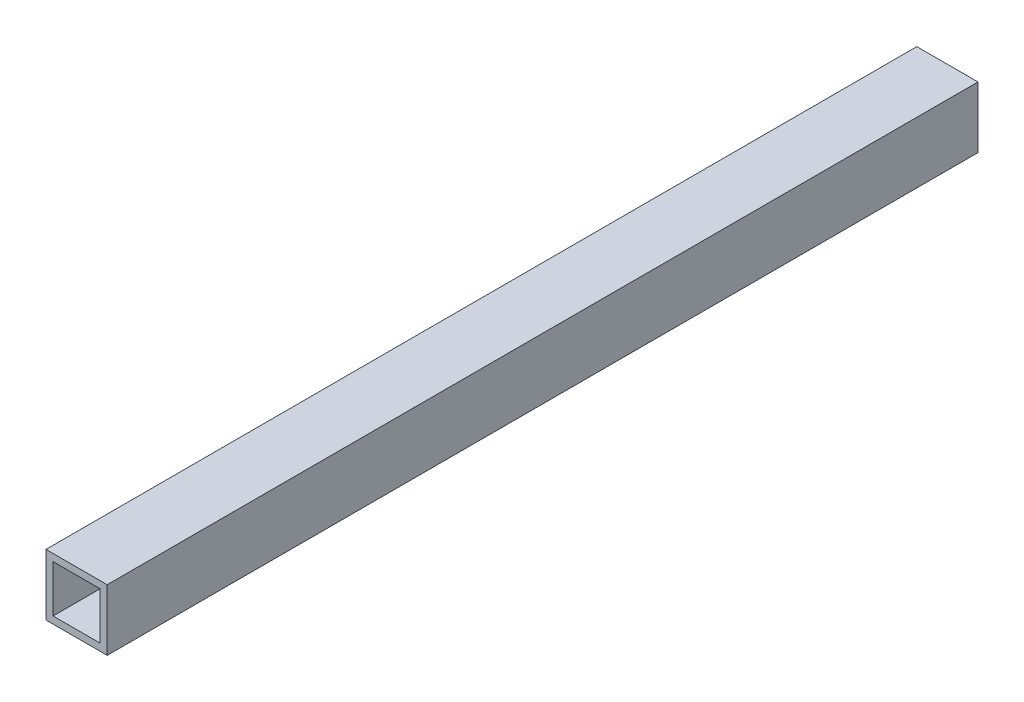
ISO-10303-21;
HEADER;
FILE_DESCRIPTION(('STEP AP214'),'2;1');
FILE_NAME('part.step','',(''),(''),'','','');
FILE_SCHEMA(('AUTOMOTIVE_DESIGN { 1 0 10303 214 1 1 1 1 }'));
ENDSEC;
DATA;
#1=APPLICATION_CONTEXT('core data for automotive mechanical design processes');
#2=APPLICATION_PROTOCOL_DEFINITION('international standard','automotive_design',2000,#1);
#3=PRODUCT_CONTEXT('',#1,'mechanical');
#4=PRODUCT('Part','Part','',(#3));
#5=PRODUCT_RELATED_PRODUCT_CATEGORY('part','',(#4));
#6=PRODUCT_DEFINITION_FORMATION('','',#4);
#7=PRODUCT_DEFINITION_CONTEXT('part definition',#1,'design');
#8=PRODUCT_DEFINITION('design','',#6,#7);
#9=PRODUCT_DEFINITION_SHAPE('','',#8);
#10=(LENGTH_UNIT() NAMED_UNIT(*) SI_UNIT(.MILLI.,.METRE.));
#11=(NAMED_UNIT(*) PLANE_ANGLE_UNIT() SI_UNIT($,.RADIAN.));
#12=(NAMED_UNIT(*) SI_UNIT($,.STERADIAN.) SOLID_ANGLE_UNIT());
#13=UNCERTAINTY_MEASURE_WITH_UNIT(LENGTH_MEASURE(1.E-05),#10,'distance_accuracy_value','');
#14=(GEOMETRIC_REPRESENTATION_CONTEXT(3) GLOBAL_UNCERTAINTY_ASSIGNED_CONTEXT((#13)) GLOBAL_UNIT_ASSIGNED_CONTEXT((#10,
#11,#12)) REPRESENTATION_CONTEXT('',''));
#15=CARTESIAN_POINT('',(0.,0.,0.));
#16=DIRECTION('',(0.,0.,1.));
#17=DIRECTION('',(1.,0.,0.));
#18=AXIS2_PLACEMENT_3D('',#15,#16,#17);
#19=CARTESIAN_POINT('',(0.,0.,185.));
#20=DIRECTION('',(0.,0.,1.));
#21=DIRECTION('',(1.,0.,0.));
#22=AXIS2_PLACEMENT_3D('',#19,#20,#21);
#23=PLANE('',#22);
#24=DIRECTION('',(0.,1.,0.));
#25=VECTOR('',#24,1.);
#26=CARTESIAN_POINT('',(6.5,6.5,185.));
#27=LINE('',#26,#25);
#28=CARTESIAN_POINT('',(6.5,-6.5,185.));
#29=VERTEX_POINT('',#28);
#30=CARTESIAN_POINT('',(6.5,6.5,185.));
#31=VERTEX_POINT('',#30);
#32=EDGE_CURVE('E136',#29,#31,#27,.T.);
#33=ORIENTED_EDGE('',*,*,#32,.T.);
#34=DIRECTION('',(-1.,0.,0.));
#35=VECTOR('',#34,1.);
#36=CARTESIAN_POINT('',(-6.5,6.5,185.));
#37=LINE('',#36,#35);
#38=CARTESIAN_POINT('',(-6.5,6.5,185.));
#39=VERTEX_POINT('',#38);
#40=EDGE_CURVE('E139',#31,#39,#37,.T.);
#41=ORIENTED_EDGE('',*,*,#40,.T.);
#42=DIRECTION('',(0.,-1.,0.));
#43=VECTOR('',#42,1.);
#44=CARTESIAN_POINT('',(-6.5,6.5,185.));
#45=LINE('',#44,#43);
#46=CARTESIAN_POINT('',(-6.5,-6.5,185.));
#47=VERTEX_POINT('',#46);
#48=EDGE_CURVE('E142',#39,#47,#45,.T.);
#49=ORIENTED_EDGE('',*,*,#48,.T.);
#50=DIRECTION('',(1.,0.,0.));
#51=VECTOR('',#50,1.);
#52=CARTESIAN_POINT('',(-6.5,-6.5,185.));
#53=LINE('',#52,#51);
#54=EDGE_CURVE('E144',#47,#29,#53,.T.);
#55=ORIENTED_EDGE('',*,*,#54,.T.);
#56=EDGE_LOOP('',(#33,#41,#49,#55));
#57=FACE_BOUND('',#56,.T.);
#58=DIRECTION('',(-1.,0.,0.));
#59=VECTOR('',#58,1.);
#60=CARTESIAN_POINT('',(-5.,5.00000000000001,185.));
#61=LINE('',#60,#59);
#62=CARTESIAN_POINT('',(5.,5.00000000000001,185.));
#63=VERTEX_POINT('',#62);
#64=CARTESIAN_POINT('',(-5.,5.00000000000001,185.));
#65=VERTEX_POINT('',#64);
#66=EDGE_CURVE('E108',#63,#65,#61,.T.);
#67=ORIENTED_EDGE('',*,*,#66,.F.);
#68=DIRECTION('',(0.,1.,0.));
#69=VECTOR('',#68,1.);
#70=CARTESIAN_POINT('',(5.,-5.,185.));
#71=LINE('',#70,#69);
#72=CARTESIAN_POINT('',(5.,-5.,185.));
#73=VERTEX_POINT('',#72);
#74=EDGE_CURVE('E100',#73,#63,#71,.T.);
#75=ORIENTED_EDGE('',*,*,#74,.F.);
#76=DIRECTION('',(1.,0.,0.));
#77=VECTOR('',#76,1.);
#78=CARTESIAN_POINT('',(-5.,-5.,185.));
#79=LINE('',#78,#77);
#80=CARTESIAN_POINT('',(-5.,-5.,185.));
#81=VERTEX_POINT('',#80);
#82=EDGE_CURVE('E122',#81,#73,#79,.T.);
#83=ORIENTED_EDGE('',*,*,#82,.F.);
#84=DIRECTION('',(0.,-1.,0.));
#85=VECTOR('',#84,1.);
#86=CARTESIAN_POINT('',(-5.,-5.,185.));
#87=LINE('',#86,#85);
#88=EDGE_CURVE('E120',#65,#81,#87,.T.);
#89=ORIENTED_EDGE('',*,*,#88,.F.);
#90=EDGE_LOOP('',(#67,#75,#83,#89));
#91=FACE_BOUND('',#90,.T.);
#92=ADVANCED_FACE('F35',(#57,#91),#23,.T.);
#93=CARTESIAN_POINT('',(0.,0.,0.));
#94=DIRECTION('',(0.,0.,1.));
#95=DIRECTION('',(1.,0.,0.));
#96=AXIS2_PLACEMENT_3D('',#93,#94,#95);
#97=PLANE('',#96);
#98=DIRECTION('',(0.,1.,0.));
#99=VECTOR('',#98,1.);
#100=CARTESIAN_POINT('',(6.5,6.5,0.));
#101=LINE('',#100,#99);
#102=CARTESIAN_POINT('',(6.5,-6.5,0.));
#103=VERTEX_POINT('',#102);
#104=CARTESIAN_POINT('',(6.5,6.5,0.));
#105=VERTEX_POINT('',#104);
#106=EDGE_CURVE('E116',#103,#105,#101,.T.);
#107=ORIENTED_EDGE('',*,*,#106,.F.);
#108=DIRECTION('',(1.,0.,0.));
#109=VECTOR('',#108,1.);
#110=CARTESIAN_POINT('',(-6.5,-6.5,0.));
#111=LINE('',#110,#109);
#112=CARTESIAN_POINT('',(-6.5,-6.5,0.));
#113=VERTEX_POINT('',#112);
#114=EDGE_CURVE('E140',#113,#103,#111,.T.);
#115=ORIENTED_EDGE('',*,*,#114,.F.);
#116=DIRECTION('',(0.,-1.,0.));
#117=VECTOR('',#116,1.);
#118=CARTESIAN_POINT('',(-6.5,6.5,0.));
#119=LINE('',#118,#117);
#120=CARTESIAN_POINT('',(-6.5,6.5,0.));
#121=VERTEX_POINT('',#120);
#122=EDGE_CURVE('E151',#121,#113,#119,.T.);
#123=ORIENTED_EDGE('',*,*,#122,.F.);
#124=DIRECTION('',(-1.,0.,0.));
#125=VECTOR('',#124,1.);
#126=CARTESIAN_POINT('',(-6.5,6.5,0.));
#127=LINE('',#126,#125);
#128=EDGE_CURVE('E149',#105,#121,#127,.T.);
#129=ORIENTED_EDGE('',*,*,#128,.F.);
#130=EDGE_LOOP('',(#107,#115,#123,#129));
#131=FACE_BOUND('',#130,.T.);
#132=DIRECTION('',(0.,1.,0.));
#133=VECTOR('',#132,1.);
#134=CARTESIAN_POINT('',(5.,-5.,0.));
#135=LINE('',#134,#133);
#136=CARTESIAN_POINT('',(5.,-5.,0.));
#137=VERTEX_POINT('',#136);
#138=CARTESIAN_POINT('',(5.,5.00000000000001,0.));
#139=VERTEX_POINT('',#138);
#140=EDGE_CURVE('E58',#137,#139,#135,.T.);
#141=ORIENTED_EDGE('',*,*,#140,.T.);
#142=DIRECTION('',(-1.,0.,0.));
#143=VECTOR('',#142,1.);
#144=CARTESIAN_POINT('',(-5.,5.00000000000001,0.));
#145=LINE('',#144,#143);
#146=CARTESIAN_POINT('',(-5.,5.00000000000001,0.));
#147=VERTEX_POINT('',#146);
#148=EDGE_CURVE('E115',#139,#147,#145,.T.);
#149=ORIENTED_EDGE('',*,*,#148,.T.);
#150=DIRECTION('',(0.,-1.,0.));
#151=VECTOR('',#150,1.);
#152=CARTESIAN_POINT('',(-5.,-5.,0.));
#153=LINE('',#152,#151);
#154=CARTESIAN_POINT('',(-5.,-5.,0.));
#155=VERTEX_POINT('',#154);
#156=EDGE_CURVE('E128',#147,#155,#153,.T.);
#157=ORIENTED_EDGE('',*,*,#156,.T.);
#158=DIRECTION('',(1.,0.,0.));
#159=VECTOR('',#158,1.);
#160=CARTESIAN_POINT('',(-5.,-5.,0.));
#161=LINE('',#160,#159);
#162=EDGE_CURVE('E109',#155,#137,#161,.T.);
#163=ORIENTED_EDGE('',*,*,#162,.T.);
#164=EDGE_LOOP('',(#141,#149,#157,#163));
#165=FACE_BOUND('',#164,.T.);
#166=ADVANCED_FACE('F169',(#131,#165),#97,.F.);
#167=CARTESIAN_POINT('',(6.5,6.5,185.));
#168=DIRECTION('',(-1.,0.,0.));
#169=DIRECTION('',(0.,0.,1.));
#170=AXIS2_PLACEMENT_3D('',#167,#168,#169);
#171=PLANE('',#170);
#172=ORIENTED_EDGE('',*,*,#106,.T.);
#173=DIRECTION('',(0.,0.,-1.));
#174=VECTOR('',#173,1.);
#175=CARTESIAN_POINT('',(6.5,6.5,185.));
#176=LINE('',#175,#174);
#177=EDGE_CURVE('E11',#31,#105,#176,.T.);
#178=ORIENTED_EDGE('',*,*,#177,.F.);
#179=ORIENTED_EDGE('',*,*,#32,.F.);
#180=DIRECTION('',(0.,0.,-1.));
#181=VECTOR('',#180,1.);
#182=CARTESIAN_POINT('',(6.5,-6.5,185.));
#183=LINE('',#182,#181);
#184=EDGE_CURVE('E146',#29,#103,#183,.T.);
#185=ORIENTED_EDGE('',*,*,#184,.T.);
#186=EDGE_LOOP('',(#172,#178,#179,#185));
#187=FACE_BOUND('',#186,.T.);
#188=ADVANCED_FACE('F37',(#187),#171,.F.);
#189=CARTESIAN_POINT('',(-6.5,6.5,185.));
#190=DIRECTION('',(0.,-1.,0.));
#191=DIRECTION('',(0.,0.,-1.));
#192=AXIS2_PLACEMENT_3D('',#189,#190,#191);
#193=PLANE('',#192);
#194=ORIENTED_EDGE('',*,*,#128,.T.);
#195=DIRECTION('',(0.,0.,-1.));
#196=VECTOR('',#195,1.);
#197=CARTESIAN_POINT('',(-6.5,6.5,185.));
#198=LINE('',#197,#196);
#199=EDGE_CURVE('E43',#39,#121,#198,.T.);
#200=ORIENTED_EDGE('',*,*,#199,.F.);
#201=ORIENTED_EDGE('',*,*,#40,.F.);
#202=ORIENTED_EDGE('',*,*,#177,.T.);
#203=EDGE_LOOP('',(#194,#200,#201,#202));
#204=FACE_BOUND('',#203,.T.);
#205=ADVANCED_FACE('F179',(#204),#193,.F.);
#206=CARTESIAN_POINT('',(-6.5,6.5,185.));
#207=DIRECTION('',(1.,0.,0.));
#208=DIRECTION('',(0.,0.,-1.));
#209=AXIS2_PLACEMENT_3D('',#206,#207,#208);
#210=PLANE('',#209);
#211=ORIENTED_EDGE('',*,*,#122,.T.);
#212=DIRECTION('',(0.,0.,-1.));
#213=VECTOR('',#212,1.);
#214=CARTESIAN_POINT('',(-6.5,-6.5,185.));
#215=LINE('',#214,#213);
#216=EDGE_CURVE('E156',#47,#113,#215,.T.);
#217=ORIENTED_EDGE('',*,*,#216,.F.);
#218=ORIENTED_EDGE('',*,*,#48,.F.);
#219=ORIENTED_EDGE('',*,*,#199,.T.);
#220=EDGE_LOOP('',(#211,#217,#218,#219));
#221=FACE_BOUND('',#220,.T.);
#222=ADVANCED_FACE('F163',(#221),#210,.F.);
#223=CARTESIAN_POINT('',(-6.5,-6.5,185.));
#224=DIRECTION('',(0.,1.,0.));
#225=DIRECTION('',(0.,0.,1.));
#226=AXIS2_PLACEMENT_3D('',#223,#224,#225);
#227=PLANE('',#226);
#228=ORIENTED_EDGE('',*,*,#114,.T.);
#229=ORIENTED_EDGE('',*,*,#184,.F.);
#230=ORIENTED_EDGE('',*,*,#54,.F.);
#231=ORIENTED_EDGE('',*,*,#216,.T.);
#232=EDGE_LOOP('',(#228,#229,#230,#231));
#233=FACE_BOUND('',#232,.T.);
#234=ADVANCED_FACE('F173',(#233),#227,.F.);
#235=CARTESIAN_POINT('',(5.,-5.,185.));
#236=DIRECTION('',(-1.,0.,0.));
#237=DIRECTION('',(0.,0.,1.));
#238=AXIS2_PLACEMENT_3D('',#235,#236,#237);
#239=PLANE('',#238);
#240=ORIENTED_EDGE('',*,*,#140,.F.);
#241=DIRECTION('',(0.,0.,-1.));
#242=VECTOR('',#241,1.);
#243=CARTESIAN_POINT('',(5.,-5.,185.));
#244=LINE('',#243,#242);
#245=EDGE_CURVE('E104',#73,#137,#244,.T.);
#246=ORIENTED_EDGE('',*,*,#245,.F.);
#247=ORIENTED_EDGE('',*,*,#74,.T.);
#248=DIRECTION('',(0.,0.,-1.));
#249=VECTOR('',#248,1.);
#250=CARTESIAN_POINT('',(5.,5.00000000000001,185.));
#251=LINE('',#250,#249);
#252=EDGE_CURVE('E103',#63,#139,#251,.T.);
#253=ORIENTED_EDGE('',*,*,#252,.T.);
#254=EDGE_LOOP('',(#240,#246,#247,#253));
#255=FACE_BOUND('',#254,.T.);
#256=ADVANCED_FACE('F102',(#255),#239,.T.);
#257=CARTESIAN_POINT('',(-5.,5.00000000000001,185.));
#258=DIRECTION('',(0.,-1.,0.));
#259=DIRECTION('',(0.,0.,-1.));
#260=AXIS2_PLACEMENT_3D('',#257,#258,#259);
#261=PLANE('',#260);
#262=ORIENTED_EDGE('',*,*,#148,.F.);
#263=ORIENTED_EDGE('',*,*,#252,.F.);
#264=ORIENTED_EDGE('',*,*,#66,.T.);
#265=DIRECTION('',(0.,0.,-1.));
#266=VECTOR('',#265,1.);
#267=CARTESIAN_POINT('',(-5.,5.00000000000001,185.));
#268=LINE('',#267,#266);
#269=EDGE_CURVE('E117',#65,#147,#268,.T.);
#270=ORIENTED_EDGE('',*,*,#269,.T.);
#271=EDGE_LOOP('',(#262,#263,#264,#270));
#272=FACE_BOUND('',#271,.T.);
#273=ADVANCED_FACE('F112',(#272),#261,.T.);
#274=CARTESIAN_POINT('',(-5.,-5.,185.));
#275=DIRECTION('',(1.,0.,0.));
#276=DIRECTION('',(0.,0.,-1.));
#277=AXIS2_PLACEMENT_3D('',#274,#275,#276);
#278=PLANE('',#277);
#279=ORIENTED_EDGE('',*,*,#156,.F.);
#280=ORIENTED_EDGE('',*,*,#269,.F.);
#281=ORIENTED_EDGE('',*,*,#88,.T.);
#282=DIRECTION('',(0.,0.,-1.));
#283=VECTOR('',#282,1.);
#284=CARTESIAN_POINT('',(-5.,-5.,185.));
#285=LINE('',#284,#283);
#286=EDGE_CURVE('E50',#81,#155,#285,.T.);
#287=ORIENTED_EDGE('',*,*,#286,.T.);
#288=EDGE_LOOP('',(#279,#280,#281,#287));
#289=FACE_BOUND('',#288,.T.);
#290=ADVANCED_FACE('F202',(#289),#278,.T.);
#291=CARTESIAN_POINT('',(-5.,-5.,185.));
#292=DIRECTION('',(0.,1.,0.));
#293=DIRECTION('',(0.,0.,1.));
#294=AXIS2_PLACEMENT_3D('',#291,#292,#293);
#295=PLANE('',#294);
#296=ORIENTED_EDGE('',*,*,#162,.F.);
#297=ORIENTED_EDGE('',*,*,#286,.F.);
#298=ORIENTED_EDGE('',*,*,#82,.T.);
#299=ORIENTED_EDGE('',*,*,#245,.T.);
#300=EDGE_LOOP('',(#296,#297,#298,#299));
#301=FACE_BOUND('',#300,.T.);
#302=ADVANCED_FACE('F206',(#301),#295,.T.);
#303=CLOSED_SHELL('',(#92,#166,#188,#205,#222,#234,#256,#273,#290,#302));
#304=MANIFOLD_SOLID_BREP('B2',#303);
#305=ADVANCED_BREP_SHAPE_REPRESENTATION('',(#18,#304),#14);
#306=SHAPE_DEFINITION_REPRESENTATION(#9,#305);
ENDSEC;
END-ISO-10303-21;
